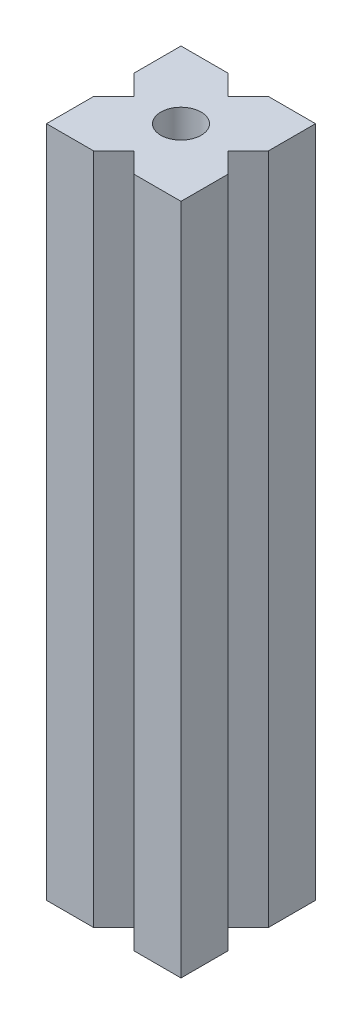
ISO-10303-21;
HEADER;
FILE_DESCRIPTION(('STEP AP214'),'2;1');
FILE_NAME('part.step','',(''),(''),'','','');
FILE_SCHEMA(('AUTOMOTIVE_DESIGN { 1 0 10303 214 1 1 1 1 }'));
ENDSEC;
DATA;
#1=APPLICATION_CONTEXT('core data for automotive mechanical design processes');
#2=APPLICATION_PROTOCOL_DEFINITION('international standard','automotive_design',2000,#1);
#3=PRODUCT_CONTEXT('',#1,'mechanical');
#4=PRODUCT('Part','Part','',(#3));
#5=PRODUCT_RELATED_PRODUCT_CATEGORY('part','',(#4));
#6=PRODUCT_DEFINITION_FORMATION('','',#4);
#7=PRODUCT_DEFINITION_CONTEXT('part definition',#1,'design');
#8=PRODUCT_DEFINITION('design','',#6,#7);
#9=PRODUCT_DEFINITION_SHAPE('','',#8);
#10=(LENGTH_UNIT() NAMED_UNIT(*) SI_UNIT(.MILLI.,.METRE.));
#11=(NAMED_UNIT(*) PLANE_ANGLE_UNIT() SI_UNIT($,.RADIAN.));
#12=(NAMED_UNIT(*) SI_UNIT($,.STERADIAN.) SOLID_ANGLE_UNIT());
#13=UNCERTAINTY_MEASURE_WITH_UNIT(LENGTH_MEASURE(1.E-05),#10,'distance_accuracy_value','');
#14=(GEOMETRIC_REPRESENTATION_CONTEXT(3) GLOBAL_UNCERTAINTY_ASSIGNED_CONTEXT((#13)) GLOBAL_UNIT_ASSIGNED_CONTEXT((#10,
#11,#12)) REPRESENTATION_CONTEXT('',''));
#15=CARTESIAN_POINT('',(0.,0.,0.));
#16=DIRECTION('',(0.,0.,1.));
#17=DIRECTION('',(1.,0.,0.));
#18=AXIS2_PLACEMENT_3D('',#15,#16,#17);
#19=CARTESIAN_POINT('',(0.,100.,0.));
#20=DIRECTION('',(1.,0.,0.));
#21=DIRECTION('',(0.,0.,-1.));
#22=AXIS2_PLACEMENT_3D('',#19,#20,#21);
#23=PLANE('',#22);
#24=DIRECTION('',(0.,0.,1.));
#25=VECTOR('',#24,1.);
#26=CARTESIAN_POINT('',(0.,100.,0.));
#27=LINE('',#26,#25);
#28=CARTESIAN_POINT('',(0.,100.,-7.));
#29=VERTEX_POINT('',#28);
#30=CARTESIAN_POINT('',(0.,100.,0.));
#31=VERTEX_POINT('',#30);
#32=EDGE_CURVE('E186',#29,#31,#27,.T.);
#33=ORIENTED_EDGE('',*,*,#32,.F.);
#34=DIRECTION('',(0.,1.,0.));
#35=VECTOR('',#34,1.);
#36=CARTESIAN_POINT('',(0.,0.,-7.));
#37=LINE('',#36,#35);
#38=CARTESIAN_POINT('',(0.,0.,-7.));
#39=VERTEX_POINT('',#38);
#40=EDGE_CURVE('E235',#39,#29,#37,.T.);
#41=ORIENTED_EDGE('',*,*,#40,.F.);
#42=DIRECTION('',(0.,0.,1.));
#43=VECTOR('',#42,1.);
#44=CARTESIAN_POINT('',(0.,0.,0.));
#45=LINE('',#44,#43);
#46=CARTESIAN_POINT('',(0.,0.,0.));
#47=VERTEX_POINT('',#46);
#48=EDGE_CURVE('E305',#39,#47,#45,.T.);
#49=ORIENTED_EDGE('',*,*,#48,.T.);
#50=DIRECTION('',(0.,-1.,0.));
#51=VECTOR('',#50,1.);
#52=CARTESIAN_POINT('',(0.,100.,0.));
#53=LINE('',#52,#51);
#54=EDGE_CURVE('E11',#31,#47,#53,.T.);
#55=ORIENTED_EDGE('',*,*,#54,.F.);
#56=EDGE_LOOP('',(#33,#41,#49,#55));
#57=FACE_BOUND('',#56,.T.);
#58=ADVANCED_FACE('F38',(#57),#23,.F.);
#59=CARTESIAN_POINT('',(0.,100.,0.));
#60=DIRECTION('',(0.,0.,-1.));
#61=DIRECTION('',(-1.,0.,0.));
#62=AXIS2_PLACEMENT_3D('',#59,#60,#61);
#63=PLANE('',#62);
#64=DIRECTION('',(1.,0.,0.));
#65=VECTOR('',#64,1.);
#66=CARTESIAN_POINT('',(0.,0.,0.));
#67=LINE('',#66,#65);
#68=CARTESIAN_POINT('',(7.,0.,0.));
#69=VERTEX_POINT('',#68);
#70=EDGE_CURVE('E306',#47,#69,#67,.T.);
#71=ORIENTED_EDGE('',*,*,#70,.T.);
#72=DIRECTION('',(0.,1.,0.));
#73=VECTOR('',#72,1.);
#74=CARTESIAN_POINT('',(7.,0.,0.));
#75=LINE('',#74,#73);
#76=CARTESIAN_POINT('',(7.,100.,0.));
#77=VERTEX_POINT('',#76);
#78=EDGE_CURVE('E274',#69,#77,#75,.T.);
#79=ORIENTED_EDGE('',*,*,#78,.T.);
#80=DIRECTION('',(1.,0.,0.));
#81=VECTOR('',#80,1.);
#82=CARTESIAN_POINT('',(0.,100.,0.));
#83=LINE('',#82,#81);
#84=EDGE_CURVE('E295',#31,#77,#83,.T.);
#85=ORIENTED_EDGE('',*,*,#84,.F.);
#86=ORIENTED_EDGE('',*,*,#54,.T.);
#87=EDGE_LOOP('',(#71,#79,#85,#86));
#88=FACE_BOUND('',#87,.T.);
#89=ADVANCED_FACE('F328',(#88),#63,.F.);
#90=CARTESIAN_POINT('',(20.,100.,0.));
#91=DIRECTION('',(-1.,0.,0.));
#92=DIRECTION('',(0.,0.,1.));
#93=AXIS2_PLACEMENT_3D('',#90,#91,#92);
#94=PLANE('',#93);
#95=DIRECTION('',(0.,0.,-1.));
#96=VECTOR('',#95,1.);
#97=CARTESIAN_POINT('',(20.,0.,0.));
#98=LINE('',#97,#96);
#99=CARTESIAN_POINT('',(20.,0.,0.));
#100=VERTEX_POINT('',#99);
#101=CARTESIAN_POINT('',(20.,0.,-7.));
#102=VERTEX_POINT('',#101);
#103=EDGE_CURVE('E179',#100,#102,#98,.T.);
#104=ORIENTED_EDGE('',*,*,#103,.T.);
#105=DIRECTION('',(0.,1.,0.));
#106=VECTOR('',#105,1.);
#107=CARTESIAN_POINT('',(20.,0.,-7.));
#108=LINE('',#107,#106);
#109=CARTESIAN_POINT('',(20.,100.,-7.));
#110=VERTEX_POINT('',#109);
#111=EDGE_CURVE('E238',#102,#110,#108,.T.);
#112=ORIENTED_EDGE('',*,*,#111,.T.);
#113=DIRECTION('',(0.,0.,-1.));
#114=VECTOR('',#113,1.);
#115=CARTESIAN_POINT('',(20.,100.,0.));
#116=LINE('',#115,#114);
#117=CARTESIAN_POINT('',(20.,100.,0.));
#118=VERTEX_POINT('',#117);
#119=EDGE_CURVE('E210',#118,#110,#116,.T.);
#120=ORIENTED_EDGE('',*,*,#119,.F.);
#121=DIRECTION('',(0.,-1.,0.));
#122=VECTOR('',#121,1.);
#123=CARTESIAN_POINT('',(20.,100.,0.));
#124=LINE('',#123,#122);
#125=EDGE_CURVE('E47',#118,#100,#124,.T.);
#126=ORIENTED_EDGE('',*,*,#125,.T.);
#127=EDGE_LOOP('',(#104,#112,#120,#126));
#128=FACE_BOUND('',#127,.T.);
#129=ADVANCED_FACE('F207',(#128),#94,.F.);
#130=CARTESIAN_POINT('',(0.,100.,-20.));
#131=DIRECTION('',(0.,0.,1.));
#132=DIRECTION('',(1.,0.,0.));
#133=AXIS2_PLACEMENT_3D('',#130,#131,#132);
#134=PLANE('',#133);
#135=DIRECTION('',(-1.,0.,0.));
#136=VECTOR('',#135,1.);
#137=CARTESIAN_POINT('',(0.,0.,-20.));
#138=LINE('',#137,#136);
#139=CARTESIAN_POINT('',(20.,0.,-20.));
#140=VERTEX_POINT('',#139);
#141=CARTESIAN_POINT('',(13.,0.,-20.));
#142=VERTEX_POINT('',#141);
#143=EDGE_CURVE('E178',#140,#142,#138,.T.);
#144=ORIENTED_EDGE('',*,*,#143,.T.);
#145=DIRECTION('',(0.,1.,0.));
#146=VECTOR('',#145,1.);
#147=CARTESIAN_POINT('',(13.,0.,-20.));
#148=LINE('',#147,#146);
#149=CARTESIAN_POINT('',(13.,100.,-20.));
#150=VERTEX_POINT('',#149);
#151=EDGE_CURVE('E335',#142,#150,#148,.T.);
#152=ORIENTED_EDGE('',*,*,#151,.T.);
#153=DIRECTION('',(-1.,0.,0.));
#154=VECTOR('',#153,1.);
#155=CARTESIAN_POINT('',(0.,100.,-20.));
#156=LINE('',#155,#154);
#157=CARTESIAN_POINT('',(20.,100.,-20.));
#158=VERTEX_POINT('',#157);
#159=EDGE_CURVE('E196',#158,#150,#156,.T.);
#160=ORIENTED_EDGE('',*,*,#159,.F.);
#161=DIRECTION('',(0.,-1.,0.));
#162=VECTOR('',#161,1.);
#163=CARTESIAN_POINT('',(20.,100.,-20.));
#164=LINE('',#163,#162);
#165=EDGE_CURVE('E195',#158,#140,#164,.T.);
#166=ORIENTED_EDGE('',*,*,#165,.T.);
#167=EDGE_LOOP('',(#144,#152,#160,#166));
#168=FACE_BOUND('',#167,.T.);
#169=ADVANCED_FACE('F378',(#168),#134,.F.);
#170=CARTESIAN_POINT('',(0.,0.,-20.));
#171=VERTEX_POINT('',#170);
#172=CARTESIAN_POINT('',(0.,0.,-13.));
#173=VERTEX_POINT('',#172);
#174=EDGE_CURVE('E176',#171,#173,#45,.T.);
#175=ORIENTED_EDGE('',*,*,#174,.T.);
#176=DIRECTION('',(0.,1.,0.));
#177=VECTOR('',#176,1.);
#178=CARTESIAN_POINT('',(0.,0.,-13.));
#179=LINE('',#178,#177);
#180=CARTESIAN_POINT('',(0.,100.,-13.));
#181=VERTEX_POINT('',#180);
#182=EDGE_CURVE('E260',#173,#181,#179,.T.);
#183=ORIENTED_EDGE('',*,*,#182,.T.);
#184=CARTESIAN_POINT('',(0.,100.,-20.));
#185=VERTEX_POINT('',#184);
#186=EDGE_CURVE('E290',#185,#181,#27,.T.);
#187=ORIENTED_EDGE('',*,*,#186,.F.);
#188=DIRECTION('',(0.,-1.,0.));
#189=VECTOR('',#188,1.);
#190=CARTESIAN_POINT('',(0.,100.,-20.));
#191=LINE('',#190,#189);
#192=EDGE_CURVE('E193',#185,#171,#191,.T.);
#193=ORIENTED_EDGE('',*,*,#192,.T.);
#194=EDGE_LOOP('',(#175,#183,#187,#193));
#195=FACE_BOUND('',#194,.T.);
#196=ADVANCED_FACE('F40',(#195),#23,.F.);
#197=CARTESIAN_POINT('',(13.,100.,0.));
#198=VERTEX_POINT('',#197);
#199=EDGE_CURVE('E294',#198,#118,#83,.T.);
#200=ORIENTED_EDGE('',*,*,#199,.F.);
#201=DIRECTION('',(0.,1.,0.));
#202=VECTOR('',#201,1.);
#203=CARTESIAN_POINT('',(13.,0.,0.));
#204=LINE('',#203,#202);
#205=CARTESIAN_POINT('',(13.,0.,0.));
#206=VERTEX_POINT('',#205);
#207=EDGE_CURVE('E284',#206,#198,#204,.T.);
#208=ORIENTED_EDGE('',*,*,#207,.F.);
#209=EDGE_CURVE('E215',#206,#100,#67,.T.);
#210=ORIENTED_EDGE('',*,*,#209,.T.);
#211=ORIENTED_EDGE('',*,*,#125,.F.);
#212=EDGE_LOOP('',(#200,#208,#210,#211));
#213=FACE_BOUND('',#212,.T.);
#214=ADVANCED_FACE('F317',(#213),#63,.F.);
#215=CARTESIAN_POINT('',(20.,100.,-13.));
#216=VERTEX_POINT('',#215);
#217=EDGE_CURVE('E299',#216,#158,#116,.T.);
#218=ORIENTED_EDGE('',*,*,#217,.F.);
#219=DIRECTION('',(0.,1.,0.));
#220=VECTOR('',#219,1.);
#221=CARTESIAN_POINT('',(20.,0.,-13.));
#222=LINE('',#221,#220);
#223=CARTESIAN_POINT('',(20.,0.,-13.));
#224=VERTEX_POINT('',#223);
#225=EDGE_CURVE('E220',#224,#216,#222,.T.);
#226=ORIENTED_EDGE('',*,*,#225,.F.);
#227=EDGE_CURVE('E189',#224,#140,#98,.T.);
#228=ORIENTED_EDGE('',*,*,#227,.T.);
#229=ORIENTED_EDGE('',*,*,#165,.F.);
#230=EDGE_LOOP('',(#218,#226,#228,#229));
#231=FACE_BOUND('',#230,.T.);
#232=ADVANCED_FACE('F376',(#231),#94,.F.);
#233=CARTESIAN_POINT('',(7.,100.,-20.));
#234=VERTEX_POINT('',#233);
#235=EDGE_CURVE('E169',#234,#185,#156,.T.);
#236=ORIENTED_EDGE('',*,*,#235,.F.);
#237=DIRECTION('',(0.,1.,0.));
#238=VECTOR('',#237,1.);
#239=CARTESIAN_POINT('',(7.,0.,-20.));
#240=LINE('',#239,#238);
#241=CARTESIAN_POINT('',(7.,0.,-20.));
#242=VERTEX_POINT('',#241);
#243=EDGE_CURVE('E155',#242,#234,#240,.T.);
#244=ORIENTED_EDGE('',*,*,#243,.F.);
#245=EDGE_CURVE('E167',#242,#171,#138,.T.);
#246=ORIENTED_EDGE('',*,*,#245,.T.);
#247=ORIENTED_EDGE('',*,*,#192,.F.);
#248=EDGE_LOOP('',(#236,#244,#246,#247));
#249=FACE_BOUND('',#248,.T.);
#250=ADVANCED_FACE('F165',(#249),#134,.F.);
#251=CARTESIAN_POINT('',(0.,100.,0.));
#252=DIRECTION('',(0.,-1.,0.));
#253=DIRECTION('',(0.,0.,-1.));
#254=AXIS2_PLACEMENT_3D('',#251,#252,#253);
#255=PLANE('',#254);
#256=CARTESIAN_POINT('',(10.,100.,-10.));
#257=DIRECTION('',(0.,1.,0.));
#258=DIRECTION('',(0.,0.,1.));
#259=AXIS2_PLACEMENT_3D('',#256,#257,#258);
#260=CIRCLE('',#259,3.);
#261=CARTESIAN_POINT('',(10.,100.,-7.));
#262=VERTEX_POINT('',#261);
#263=EDGE_CURVE('E353',#262,#262,#260,.T.);
#264=ORIENTED_EDGE('',*,*,#263,.F.);
#265=EDGE_LOOP('',(#264));
#266=FACE_BOUND('',#265,.T.);
#267=ORIENTED_EDGE('',*,*,#159,.T.);
#268=DIRECTION('',(0.707106781186548,0.,-0.707106781186547));
#269=VECTOR('',#268,1.);
#270=CARTESIAN_POINT('',(13.,100.,-20.));
#271=LINE('',#270,#269);
#272=CARTESIAN_POINT('',(10.,100.,-17.));
#273=VERTEX_POINT('',#272);
#274=EDGE_CURVE('E161',#273,#150,#271,.T.);
#275=ORIENTED_EDGE('',*,*,#274,.F.);
#276=DIRECTION('',(0.707106781186548,0.,0.707106781186547));
#277=VECTOR('',#276,1.);
#278=CARTESIAN_POINT('',(7.,100.,-20.));
#279=LINE('',#278,#277);
#280=EDGE_CURVE('E240',#234,#273,#279,.T.);
#281=ORIENTED_EDGE('',*,*,#280,.F.);
#282=ORIENTED_EDGE('',*,*,#235,.T.);
#283=ORIENTED_EDGE('',*,*,#186,.T.);
#284=DIRECTION('',(-0.707106781186547,0.,-0.707106781186547));
#285=VECTOR('',#284,1.);
#286=CARTESIAN_POINT('',(0.,100.,-13.));
#287=LINE('',#286,#285);
#288=CARTESIAN_POINT('',(3.,100.,-10.));
#289=VERTEX_POINT('',#288);
#290=EDGE_CURVE('E247',#289,#181,#287,.T.);
#291=ORIENTED_EDGE('',*,*,#290,.F.);
#292=DIRECTION('',(0.707106781186547,0.,-0.707106781186548));
#293=VECTOR('',#292,1.);
#294=CARTESIAN_POINT('',(0.,100.,-7.));
#295=LINE('',#294,#293);
#296=EDGE_CURVE('E251',#29,#289,#295,.T.);
#297=ORIENTED_EDGE('',*,*,#296,.F.);
#298=ORIENTED_EDGE('',*,*,#32,.T.);
#299=ORIENTED_EDGE('',*,*,#84,.T.);
#300=DIRECTION('',(-0.707106781186547,0.,0.707106781186548));
#301=VECTOR('',#300,1.);
#302=CARTESIAN_POINT('',(7.,100.,0.));
#303=LINE('',#302,#301);
#304=CARTESIAN_POINT('',(10.,100.,-3.));
#305=VERTEX_POINT('',#304);
#306=EDGE_CURVE('E275',#305,#77,#303,.T.);
#307=ORIENTED_EDGE('',*,*,#306,.F.);
#308=DIRECTION('',(-0.707106781186548,0.,-0.707106781186547));
#309=VECTOR('',#308,1.);
#310=CARTESIAN_POINT('',(13.,100.,0.));
#311=LINE('',#310,#309);
#312=EDGE_CURVE('E271',#198,#305,#311,.T.);
#313=ORIENTED_EDGE('',*,*,#312,.F.);
#314=ORIENTED_EDGE('',*,*,#199,.T.);
#315=ORIENTED_EDGE('',*,*,#119,.T.);
#316=DIRECTION('',(0.707106781186547,0.,0.707106781186548));
#317=VECTOR('',#316,1.);
#318=CARTESIAN_POINT('',(20.,100.,-7.));
#319=LINE('',#318,#317);
#320=CARTESIAN_POINT('',(17.,100.,-10.));
#321=VERTEX_POINT('',#320);
#322=EDGE_CURVE('E228',#321,#110,#319,.T.);
#323=ORIENTED_EDGE('',*,*,#322,.F.);
#324=DIRECTION('',(-0.707106781186547,0.,0.707106781186548));
#325=VECTOR('',#324,1.);
#326=CARTESIAN_POINT('',(20.,100.,-13.));
#327=LINE('',#326,#325);
#328=EDGE_CURVE('E231',#216,#321,#327,.T.);
#329=ORIENTED_EDGE('',*,*,#328,.F.);
#330=ORIENTED_EDGE('',*,*,#217,.T.);
#331=EDGE_LOOP('',(#267,#275,#281,#282,#283,#291,#297,#298,#299,#307,#313,#314,#315,#323,#329,#330));
#332=FACE_BOUND('',#331,.T.);
#333=ADVANCED_FACE('F324',(#266,#332),#255,.F.);
#334=CARTESIAN_POINT('',(0.,0.,0.));
#335=DIRECTION('',(0.,-1.,0.));
#336=DIRECTION('',(0.,0.,-1.));
#337=AXIS2_PLACEMENT_3D('',#334,#335,#336);
#338=PLANE('',#337);
#339=CARTESIAN_POINT('',(10.,0.,-10.));
#340=DIRECTION('',(0.,1.,0.));
#341=DIRECTION('',(0.,0.,1.));
#342=AXIS2_PLACEMENT_3D('',#339,#340,#341);
#343=CIRCLE('',#342,3.);
#344=CARTESIAN_POINT('',(10.,0.,-7.));
#345=VERTEX_POINT('',#344);
#346=EDGE_CURVE('E278',#345,#345,#343,.T.);
#347=ORIENTED_EDGE('',*,*,#346,.T.);
#348=EDGE_LOOP('',(#347));
#349=FACE_BOUND('',#348,.T.);
#350=DIRECTION('',(0.707106781186548,0.,-0.707106781186547));
#351=VECTOR('',#350,1.);
#352=CARTESIAN_POINT('',(13.,0.,-20.));
#353=LINE('',#352,#351);
#354=CARTESIAN_POINT('',(10.,0.,-17.));
#355=VERTEX_POINT('',#354);
#356=EDGE_CURVE('E54',#355,#142,#353,.T.);
#357=ORIENTED_EDGE('',*,*,#356,.T.);
#358=ORIENTED_EDGE('',*,*,#143,.F.);
#359=ORIENTED_EDGE('',*,*,#227,.F.);
#360=DIRECTION('',(-0.707106781186547,0.,0.707106781186548));
#361=VECTOR('',#360,1.);
#362=CARTESIAN_POINT('',(20.,0.,-13.));
#363=LINE('',#362,#361);
#364=CARTESIAN_POINT('',(17.,0.,-10.));
#365=VERTEX_POINT('',#364);
#366=EDGE_CURVE('E218',#224,#365,#363,.T.);
#367=ORIENTED_EDGE('',*,*,#366,.T.);
#368=DIRECTION('',(0.707106781186547,0.,0.707106781186548));
#369=VECTOR('',#368,1.);
#370=CARTESIAN_POINT('',(20.,0.,-7.));
#371=LINE('',#370,#369);
#372=EDGE_CURVE('E62',#365,#102,#371,.T.);
#373=ORIENTED_EDGE('',*,*,#372,.T.);
#374=ORIENTED_EDGE('',*,*,#103,.F.);
#375=ORIENTED_EDGE('',*,*,#209,.F.);
#376=DIRECTION('',(-0.707106781186548,0.,-0.707106781186547));
#377=VECTOR('',#376,1.);
#378=CARTESIAN_POINT('',(13.,0.,0.));
#379=LINE('',#378,#377);
#380=CARTESIAN_POINT('',(10.,0.,-3.));
#381=VERTEX_POINT('',#380);
#382=EDGE_CURVE('E270',#206,#381,#379,.T.);
#383=ORIENTED_EDGE('',*,*,#382,.T.);
#384=DIRECTION('',(-0.707106781186547,0.,0.707106781186548));
#385=VECTOR('',#384,1.);
#386=CARTESIAN_POINT('',(7.,0.,0.));
#387=LINE('',#386,#385);
#388=EDGE_CURVE('E266',#381,#69,#387,.T.);
#389=ORIENTED_EDGE('',*,*,#388,.T.);
#390=ORIENTED_EDGE('',*,*,#70,.F.);
#391=ORIENTED_EDGE('',*,*,#48,.F.);
#392=DIRECTION('',(0.707106781186547,0.,-0.707106781186548));
#393=VECTOR('',#392,1.);
#394=CARTESIAN_POINT('',(0.,0.,-7.));
#395=LINE('',#394,#393);
#396=CARTESIAN_POINT('',(3.,0.,-10.));
#397=VERTEX_POINT('',#396);
#398=EDGE_CURVE('E242',#39,#397,#395,.T.);
#399=ORIENTED_EDGE('',*,*,#398,.T.);
#400=DIRECTION('',(-0.707106781186547,0.,-0.707106781186547));
#401=VECTOR('',#400,1.);
#402=CARTESIAN_POINT('',(0.,0.,-13.));
#403=LINE('',#402,#401);
#404=EDGE_CURVE('E246',#397,#173,#403,.T.);
#405=ORIENTED_EDGE('',*,*,#404,.T.);
#406=ORIENTED_EDGE('',*,*,#174,.F.);
#407=ORIENTED_EDGE('',*,*,#245,.F.);
#408=DIRECTION('',(0.707106781186548,0.,0.707106781186547));
#409=VECTOR('',#408,1.);
#410=CARTESIAN_POINT('',(7.,0.,-20.));
#411=LINE('',#410,#409);
#412=EDGE_CURVE('E151',#242,#355,#411,.T.);
#413=ORIENTED_EDGE('',*,*,#412,.T.);
#414=EDGE_LOOP('',(#357,#358,#359,#367,#373,#374,#375,#383,#389,#390,#391,#399,#405,#406,#407,#413));
#415=FACE_BOUND('',#414,.T.);
#416=ADVANCED_FACE('F173',(#349,#415),#338,.T.);
#417=CARTESIAN_POINT('',(7.,0.,0.));
#418=DIRECTION('',(-0.707106781186548,0.,-0.707106781186547));
#419=DIRECTION('',(-0.707106781186547,0.,0.707106781186548));
#420=AXIS2_PLACEMENT_3D('',#417,#418,#419);
#421=PLANE('',#420);
#422=ORIENTED_EDGE('',*,*,#306,.T.);
#423=ORIENTED_EDGE('',*,*,#78,.F.);
#424=ORIENTED_EDGE('',*,*,#388,.F.);
#425=DIRECTION('',(0.,1.,0.));
#426=VECTOR('',#425,1.);
#427=CARTESIAN_POINT('',(10.,0.,-3.));
#428=LINE('',#427,#426);
#429=EDGE_CURVE('E255',#381,#305,#428,.T.);
#430=ORIENTED_EDGE('',*,*,#429,.T.);
#431=EDGE_LOOP('',(#422,#423,#424,#430));
#432=FACE_BOUND('',#431,.T.);
#433=ADVANCED_FACE('F327',(#432),#421,.F.);
#434=CARTESIAN_POINT('',(13.,0.,0.));
#435=DIRECTION('',(0.707106781186547,0.,-0.707106781186548));
#436=DIRECTION('',(-0.707106781186548,0.,-0.707106781186547));
#437=AXIS2_PLACEMENT_3D('',#434,#435,#436);
#438=PLANE('',#437);
#439=ORIENTED_EDGE('',*,*,#312,.T.);
#440=ORIENTED_EDGE('',*,*,#429,.F.);
#441=ORIENTED_EDGE('',*,*,#382,.F.);
#442=ORIENTED_EDGE('',*,*,#207,.T.);
#443=EDGE_LOOP('',(#439,#440,#441,#442));
#444=FACE_BOUND('',#443,.T.);
#445=ADVANCED_FACE('F320',(#444),#438,.F.);
#446=CARTESIAN_POINT('',(0.,0.,-7.));
#447=DIRECTION('',(0.707106781186548,0.,0.707106781186547));
#448=DIRECTION('',(0.707106781186547,0.,-0.707106781186548));
#449=AXIS2_PLACEMENT_3D('',#446,#447,#448);
#450=PLANE('',#449);
#451=ORIENTED_EDGE('',*,*,#296,.T.);
#452=DIRECTION('',(0.,1.,0.));
#453=VECTOR('',#452,1.);
#454=CARTESIAN_POINT('',(3.,0.,-10.));
#455=LINE('',#454,#453);
#456=EDGE_CURVE('E250',#397,#289,#455,.T.);
#457=ORIENTED_EDGE('',*,*,#456,.F.);
#458=ORIENTED_EDGE('',*,*,#398,.F.);
#459=ORIENTED_EDGE('',*,*,#40,.T.);
#460=EDGE_LOOP('',(#451,#457,#458,#459));
#461=FACE_BOUND('',#460,.T.);
#462=ADVANCED_FACE('F485',(#461),#450,.F.);
#463=CARTESIAN_POINT('',(0.,0.,-13.));
#464=DIRECTION('',(0.707106781186547,0.,-0.707106781186547));
#465=DIRECTION('',(-0.707106781186548,0.,-0.707106781186548));
#466=AXIS2_PLACEMENT_3D('',#463,#464,#465);
#467=PLANE('',#466);
#468=ORIENTED_EDGE('',*,*,#290,.T.);
#469=ORIENTED_EDGE('',*,*,#182,.F.);
#470=ORIENTED_EDGE('',*,*,#404,.F.);
#471=ORIENTED_EDGE('',*,*,#456,.T.);
#472=EDGE_LOOP('',(#468,#469,#470,#471));
#473=FACE_BOUND('',#472,.T.);
#474=ADVANCED_FACE('F490',(#473),#467,.F.);
#475=CARTESIAN_POINT('',(20.,0.,-7.));
#476=DIRECTION('',(-0.707106781186548,0.,0.707106781186547));
#477=DIRECTION('',(0.707106781186547,0.,0.707106781186548));
#478=AXIS2_PLACEMENT_3D('',#475,#476,#477);
#479=PLANE('',#478);
#480=ORIENTED_EDGE('',*,*,#322,.T.);
#481=ORIENTED_EDGE('',*,*,#111,.F.);
#482=ORIENTED_EDGE('',*,*,#372,.F.);
#483=DIRECTION('',(0.,1.,0.));
#484=VECTOR('',#483,1.);
#485=CARTESIAN_POINT('',(17.,0.,-10.));
#486=LINE('',#485,#484);
#487=EDGE_CURVE('E226',#365,#321,#486,.T.);
#488=ORIENTED_EDGE('',*,*,#487,.T.);
#489=EDGE_LOOP('',(#480,#481,#482,#488));
#490=FACE_BOUND('',#489,.T.);
#491=ADVANCED_FACE('F537',(#490),#479,.F.);
#492=CARTESIAN_POINT('',(20.,0.,-13.));
#493=DIRECTION('',(-0.707106781186548,0.,-0.707106781186547));
#494=DIRECTION('',(-0.707106781186547,0.,0.707106781186548));
#495=AXIS2_PLACEMENT_3D('',#492,#493,#494);
#496=PLANE('',#495);
#497=ORIENTED_EDGE('',*,*,#328,.T.);
#498=ORIENTED_EDGE('',*,*,#487,.F.);
#499=ORIENTED_EDGE('',*,*,#366,.F.);
#500=ORIENTED_EDGE('',*,*,#225,.T.);
#501=EDGE_LOOP('',(#497,#498,#499,#500));
#502=FACE_BOUND('',#501,.T.);
#503=ADVANCED_FACE('F403',(#502),#496,.F.);
#504=CARTESIAN_POINT('',(13.,0.,-20.));
#505=DIRECTION('',(0.707106781186547,0.,0.707106781186548));
#506=DIRECTION('',(0.707106781186548,0.,-0.707106781186547));
#507=AXIS2_PLACEMENT_3D('',#504,#505,#506);
#508=PLANE('',#507);
#509=ORIENTED_EDGE('',*,*,#274,.T.);
#510=ORIENTED_EDGE('',*,*,#151,.F.);
#511=ORIENTED_EDGE('',*,*,#356,.F.);
#512=DIRECTION('',(0.,1.,0.));
#513=VECTOR('',#512,1.);
#514=CARTESIAN_POINT('',(10.,0.,-17.));
#515=LINE('',#514,#513);
#516=EDGE_CURVE('E157',#355,#273,#515,.T.);
#517=ORIENTED_EDGE('',*,*,#516,.T.);
#518=EDGE_LOOP('',(#509,#510,#511,#517));
#519=FACE_BOUND('',#518,.T.);
#520=ADVANCED_FACE('F399',(#519),#508,.F.);
#521=CARTESIAN_POINT('',(7.,0.,-20.));
#522=DIRECTION('',(-0.707106781186547,0.,0.707106781186548));
#523=DIRECTION('',(0.707106781186548,0.,0.707106781186547));
#524=AXIS2_PLACEMENT_3D('',#521,#522,#523);
#525=PLANE('',#524);
#526=ORIENTED_EDGE('',*,*,#280,.T.);
#527=ORIENTED_EDGE('',*,*,#516,.F.);
#528=ORIENTED_EDGE('',*,*,#412,.F.);
#529=ORIENTED_EDGE('',*,*,#243,.T.);
#530=EDGE_LOOP('',(#526,#527,#528,#529));
#531=FACE_BOUND('',#530,.T.);
#532=ADVANCED_FACE('F154',(#531),#525,.F.);
#533=CARTESIAN_POINT('',(10.,0.,-10.));
#534=DIRECTION('',(0.,1.,0.));
#535=DIRECTION('',(0.,0.,1.));
#536=AXIS2_PLACEMENT_3D('',#533,#534,#535);
#537=CYLINDRICAL_SURFACE('',#536,3.);
#538=ORIENTED_EDGE('',*,*,#346,.F.);
#539=EDGE_LOOP('',(#538));
#540=FACE_BOUND('',#539,.T.);
#541=ORIENTED_EDGE('',*,*,#263,.T.);
#542=EDGE_LOOP('',(#541));
#543=FACE_BOUND('',#542,.T.);
#544=ADVANCED_FACE('F363',(#540,#543),#537,.F.);
#545=CLOSED_SHELL('',(#58,#89,#129,#169,#196,#214,#232,#250,#333,#416,#433,#445,#462,#474,#491,
#503,#520,#532,#544));
#546=MANIFOLD_SOLID_BREP('B2',#545);
#547=ADVANCED_BREP_SHAPE_REPRESENTATION('',(#18,#546),#14);
#548=SHAPE_DEFINITION_REPRESENTATION(#9,#547);
ENDSEC;
END-ISO-10303-21;
